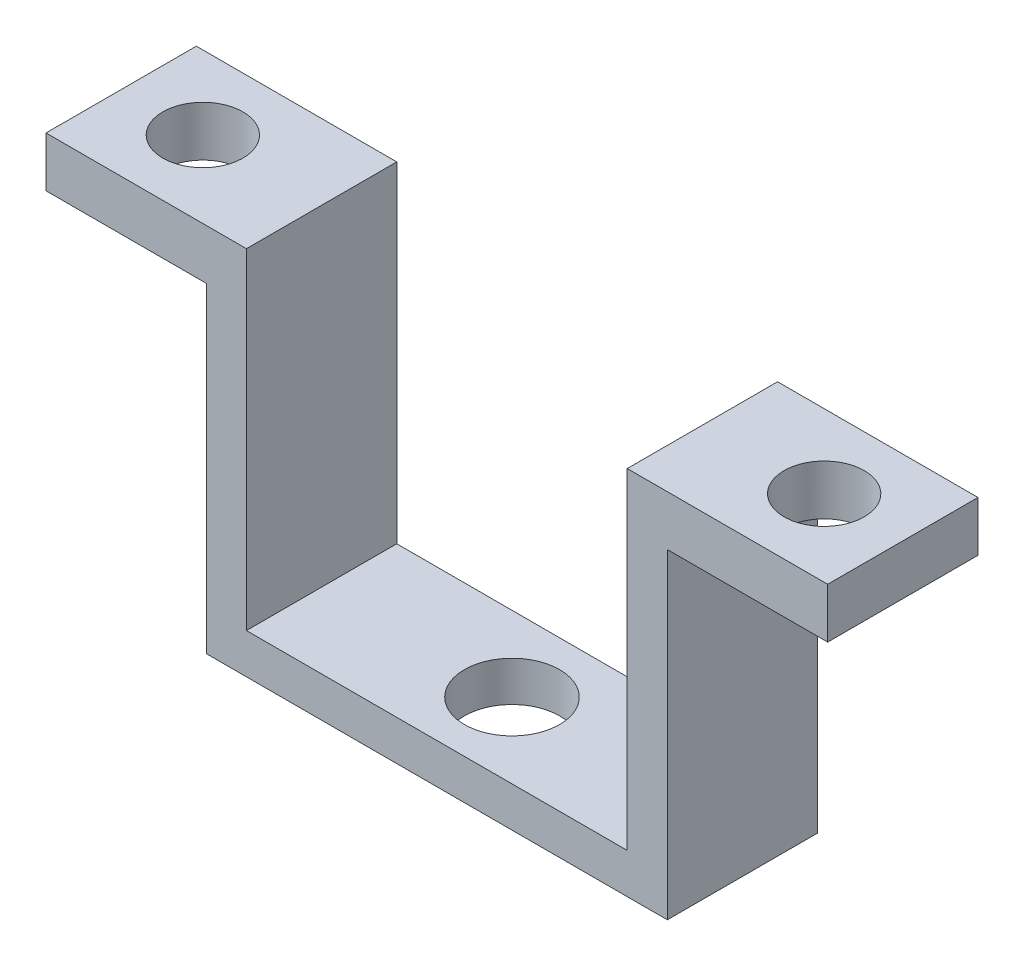
ISO-10303-21;
HEADER;
FILE_DESCRIPTION(('STEP AP214'),'2;1');
FILE_NAME('part.step','',(''),(''),'','','');
FILE_SCHEMA(('AUTOMOTIVE_DESIGN { 1 0 10303 214 1 1 1 1 }'));
ENDSEC;
DATA;
#1=APPLICATION_CONTEXT('core data for automotive mechanical design processes');
#2=APPLICATION_PROTOCOL_DEFINITION('international standard','automotive_design',2000,#1);
#3=PRODUCT_CONTEXT('',#1,'mechanical');
#4=PRODUCT('Part','Part','',(#3));
#5=PRODUCT_RELATED_PRODUCT_CATEGORY('part','',(#4));
#6=PRODUCT_DEFINITION_FORMATION('','',#4);
#7=PRODUCT_DEFINITION_CONTEXT('part definition',#1,'design');
#8=PRODUCT_DEFINITION('design','',#6,#7);
#9=PRODUCT_DEFINITION_SHAPE('','',#8);
#10=(LENGTH_UNIT() NAMED_UNIT(*) SI_UNIT(.MILLI.,.METRE.));
#11=(NAMED_UNIT(*) PLANE_ANGLE_UNIT() SI_UNIT($,.RADIAN.));
#12=(NAMED_UNIT(*) SI_UNIT($,.STERADIAN.) SOLID_ANGLE_UNIT());
#13=UNCERTAINTY_MEASURE_WITH_UNIT(LENGTH_MEASURE(1.E-05),#10,'distance_accuracy_value','');
#14=(GEOMETRIC_REPRESENTATION_CONTEXT(3) GLOBAL_UNCERTAINTY_ASSIGNED_CONTEXT((#13)) GLOBAL_UNIT_ASSIGNED_CONTEXT((#10,
#11,#12)) REPRESENTATION_CONTEXT('',''));
#15=CARTESIAN_POINT('',(0.,0.,0.));
#16=DIRECTION('',(0.,0.,1.));
#17=DIRECTION('',(1.,0.,0.));
#18=AXIS2_PLACEMENT_3D('',#15,#16,#17);
#19=CARTESIAN_POINT('',(23.,28.,7.5));
#20=DIRECTION('',(-1.,0.,0.));
#21=DIRECTION('',(0.,-1.,0.));
#22=AXIS2_PLACEMENT_3D('',#19,#20,#21);
#23=PLANE('',#22);
#24=DIRECTION('',(0.,1.,0.));
#25=VECTOR('',#24,1.);
#26=CARTESIAN_POINT('',(23.,28.,-7.5));
#27=LINE('',#26,#25);
#28=CARTESIAN_POINT('',(23.,-4.,-7.5));
#29=VERTEX_POINT('',#28);
#30=CARTESIAN_POINT('',(23.,28.,-7.5));
#31=VERTEX_POINT('',#30);
#32=EDGE_CURVE('E159',#29,#31,#27,.T.);
#33=ORIENTED_EDGE('',*,*,#32,.T.);
#34=DIRECTION('',(0.,0.,-1.));
#35=VECTOR('',#34,1.);
#36=CARTESIAN_POINT('',(23.,28.,7.5));
#37=LINE('',#36,#35);
#38=CARTESIAN_POINT('',(23.,28.,7.5));
#39=VERTEX_POINT('',#38);
#40=EDGE_CURVE('E11',#39,#31,#37,.T.);
#41=ORIENTED_EDGE('',*,*,#40,.F.);
#42=DIRECTION('',(0.,1.,0.));
#43=VECTOR('',#42,1.);
#44=CARTESIAN_POINT('',(23.,28.,7.5));
#45=LINE('',#44,#43);
#46=CARTESIAN_POINT('',(23.,-4.,7.5));
#47=VERTEX_POINT('',#46);
#48=EDGE_CURVE('E182',#47,#39,#45,.T.);
#49=ORIENTED_EDGE('',*,*,#48,.F.);
#50=DIRECTION('',(0.,0.,-1.));
#51=VECTOR('',#50,1.);
#52=CARTESIAN_POINT('',(23.,-4.,7.5));
#53=LINE('',#52,#51);
#54=EDGE_CURVE('E155',#47,#29,#53,.T.);
#55=ORIENTED_EDGE('',*,*,#54,.T.);
#56=EDGE_LOOP('',(#33,#41,#49,#55));
#57=FACE_BOUND('',#56,.T.);
#58=ADVANCED_FACE('F37',(#57),#23,.F.);
#59=CARTESIAN_POINT('',(39.,28.,7.5));
#60=DIRECTION('',(0.,1.,0.));
#61=DIRECTION('',(0.,0.,1.));
#62=AXIS2_PLACEMENT_3D('',#59,#60,#61);
#63=PLANE('',#62);
#64=CARTESIAN_POINT('',(31.,28.,-0.149250584268186));
#65=DIRECTION('',(0.,1.,0.));
#66=DIRECTION('',(0.,0.,1.));
#67=AXIS2_PLACEMENT_3D('',#64,#65,#66);
#68=CIRCLE('',#67,3.99999999999999);
#69=CARTESIAN_POINT('',(31.,28.,3.85074941573181));
#70=VERTEX_POINT('',#69);
#71=EDGE_CURVE('E207',#70,#70,#68,.T.);
#72=ORIENTED_EDGE('',*,*,#71,.T.);
#73=EDGE_LOOP('',(#72));
#74=FACE_BOUND('',#73,.T.);
#75=DIRECTION('',(1.,0.,0.));
#76=VECTOR('',#75,1.);
#77=CARTESIAN_POINT('',(39.,28.,-7.5));
#78=LINE('',#77,#76);
#79=CARTESIAN_POINT('',(39.,28.,-7.5));
#80=VERTEX_POINT('',#79);
#81=EDGE_CURVE('E162',#31,#80,#78,.T.);
#82=ORIENTED_EDGE('',*,*,#81,.T.);
#83=DIRECTION('',(0.,0.,-1.));
#84=VECTOR('',#83,1.);
#85=CARTESIAN_POINT('',(39.,28.,7.5));
#86=LINE('',#85,#84);
#87=CARTESIAN_POINT('',(39.,28.,7.5));
#88=VERTEX_POINT('',#87);
#89=EDGE_CURVE('E46',#88,#80,#86,.T.);
#90=ORIENTED_EDGE('',*,*,#89,.F.);
#91=DIRECTION('',(1.,0.,0.));
#92=VECTOR('',#91,1.);
#93=CARTESIAN_POINT('',(39.,28.,7.5));
#94=LINE('',#93,#92);
#95=EDGE_CURVE('E110',#39,#88,#94,.T.);
#96=ORIENTED_EDGE('',*,*,#95,.F.);
#97=ORIENTED_EDGE('',*,*,#40,.T.);
#98=EDGE_LOOP('',(#82,#90,#96,#97));
#99=FACE_BOUND('',#98,.T.);
#100=ADVANCED_FACE('F263',(#74,#99),#63,.F.);
#101=CARTESIAN_POINT('',(39.,33.,7.5));
#102=DIRECTION('',(-1.,0.,0.));
#103=DIRECTION('',(0.,0.,1.));
#104=AXIS2_PLACEMENT_3D('',#101,#102,#103);
#105=PLANE('',#104);
#106=DIRECTION('',(0.,1.,0.));
#107=VECTOR('',#106,1.);
#108=CARTESIAN_POINT('',(39.,33.,-7.5));
#109=LINE('',#108,#107);
#110=CARTESIAN_POINT('',(39.,33.,-7.5));
#111=VERTEX_POINT('',#110);
#112=EDGE_CURVE('E165',#80,#111,#109,.T.);
#113=ORIENTED_EDGE('',*,*,#112,.T.);
#114=DIRECTION('',(0.,0.,-1.));
#115=VECTOR('',#114,1.);
#116=CARTESIAN_POINT('',(39.,33.,7.5));
#117=LINE('',#116,#115);
#118=CARTESIAN_POINT('',(39.,33.,7.5));
#119=VERTEX_POINT('',#118);
#120=EDGE_CURVE('E201',#119,#111,#117,.T.);
#121=ORIENTED_EDGE('',*,*,#120,.F.);
#122=DIRECTION('',(0.,1.,0.));
#123=VECTOR('',#122,1.);
#124=CARTESIAN_POINT('',(39.,33.,7.5));
#125=LINE('',#124,#123);
#126=EDGE_CURVE('E224',#88,#119,#125,.T.);
#127=ORIENTED_EDGE('',*,*,#126,.F.);
#128=ORIENTED_EDGE('',*,*,#89,.T.);
#129=EDGE_LOOP('',(#113,#121,#127,#128));
#130=FACE_BOUND('',#129,.T.);
#131=ADVANCED_FACE('F267',(#130),#105,.F.);
#132=CARTESIAN_POINT('',(19.,33.,7.5));
#133=DIRECTION('',(0.,-1.,0.));
#134=DIRECTION('',(0.,0.,-1.));
#135=AXIS2_PLACEMENT_3D('',#132,#133,#134);
#136=PLANE('',#135);
#137=CARTESIAN_POINT('',(31.,33.,-0.149250584268186));
#138=DIRECTION('',(0.,-1.,0.));
#139=DIRECTION('',(0.,0.,-1.));
#140=AXIS2_PLACEMENT_3D('',#137,#138,#139);
#141=CIRCLE('',#140,3.99999999999999);
#142=CARTESIAN_POINT('',(31.,33.,-4.14925058426818));
#143=VERTEX_POINT('',#142);
#144=EDGE_CURVE('E219',#143,#143,#141,.T.);
#145=ORIENTED_EDGE('',*,*,#144,.T.);
#146=EDGE_LOOP('',(#145));
#147=FACE_BOUND('',#146,.T.);
#148=DIRECTION('',(-1.,0.,0.));
#149=VECTOR('',#148,1.);
#150=CARTESIAN_POINT('',(19.,33.,-7.5));
#151=LINE('',#150,#149);
#152=CARTESIAN_POINT('',(19.,33.,-7.5));
#153=VERTEX_POINT('',#152);
#154=EDGE_CURVE('E167',#111,#153,#151,.T.);
#155=ORIENTED_EDGE('',*,*,#154,.T.);
#156=DIRECTION('',(0.,0.,-1.));
#157=VECTOR('',#156,1.);
#158=CARTESIAN_POINT('',(19.,33.,7.5));
#159=LINE('',#158,#157);
#160=CARTESIAN_POINT('',(19.,33.,7.5));
#161=VERTEX_POINT('',#160);
#162=EDGE_CURVE('E198',#161,#153,#159,.T.);
#163=ORIENTED_EDGE('',*,*,#162,.F.);
#164=DIRECTION('',(-1.,0.,0.));
#165=VECTOR('',#164,1.);
#166=CARTESIAN_POINT('',(19.,33.,7.5));
#167=LINE('',#166,#165);
#168=EDGE_CURVE('E226',#119,#161,#167,.T.);
#169=ORIENTED_EDGE('',*,*,#168,.F.);
#170=ORIENTED_EDGE('',*,*,#120,.T.);
#171=EDGE_LOOP('',(#155,#163,#169,#170));
#172=FACE_BOUND('',#171,.T.);
#173=ADVANCED_FACE('F271',(#147,#172),#136,.F.);
#174=CARTESIAN_POINT('',(19.,0.,7.5));
#175=DIRECTION('',(1.,0.,0.));
#176=DIRECTION('',(0.,0.,-1.));
#177=AXIS2_PLACEMENT_3D('',#174,#175,#176);
#178=PLANE('',#177);
#179=DIRECTION('',(0.,-1.,0.));
#180=VECTOR('',#179,1.);
#181=CARTESIAN_POINT('',(19.,0.,-7.5));
#182=LINE('',#181,#180);
#183=CARTESIAN_POINT('',(19.,0.,-7.5));
#184=VERTEX_POINT('',#183);
#185=EDGE_CURVE('E169',#153,#184,#182,.T.);
#186=ORIENTED_EDGE('',*,*,#185,.T.);
#187=DIRECTION('',(0.,0.,-1.));
#188=VECTOR('',#187,1.);
#189=CARTESIAN_POINT('',(19.,0.,7.5));
#190=LINE('',#189,#188);
#191=CARTESIAN_POINT('',(19.,0.,7.5));
#192=VERTEX_POINT('',#191);
#193=EDGE_CURVE('E195',#192,#184,#190,.T.);
#194=ORIENTED_EDGE('',*,*,#193,.F.);
#195=DIRECTION('',(0.,-1.,0.));
#196=VECTOR('',#195,1.);
#197=CARTESIAN_POINT('',(19.,0.,7.5));
#198=LINE('',#197,#196);
#199=EDGE_CURVE('E228',#161,#192,#198,.T.);
#200=ORIENTED_EDGE('',*,*,#199,.F.);
#201=ORIENTED_EDGE('',*,*,#162,.T.);
#202=EDGE_LOOP('',(#186,#194,#200,#201));
#203=FACE_BOUND('',#202,.T.);
#204=ADVANCED_FACE('F277',(#203),#178,.F.);
#205=CARTESIAN_POINT('',(19.,0.,7.5));
#206=DIRECTION('',(0.,-1.,0.));
#207=DIRECTION('',(0.,0.,-1.));
#208=AXIS2_PLACEMENT_3D('',#205,#206,#207);
#209=PLANE('',#208);
#210=CARTESIAN_POINT('',(0.,0.,0.));
#211=DIRECTION('',(0.,-1.,0.));
#212=DIRECTION('',(0.,0.,-1.));
#213=AXIS2_PLACEMENT_3D('',#210,#211,#212);
#214=CIRCLE('',#213,4.75);
#215=CARTESIAN_POINT('',(0.,0.,-4.75));
#216=VERTEX_POINT('',#215);
#217=EDGE_CURVE('E163',#216,#216,#214,.T.);
#218=ORIENTED_EDGE('',*,*,#217,.T.);
#219=EDGE_LOOP('',(#218));
#220=FACE_BOUND('',#219,.T.);
#221=DIRECTION('',(-1.,0.,0.));
#222=VECTOR('',#221,1.);
#223=CARTESIAN_POINT('',(19.,0.,-7.5));
#224=LINE('',#223,#222);
#225=CARTESIAN_POINT('',(-19.,0.,-7.5));
#226=VERTEX_POINT('',#225);
#227=EDGE_CURVE('E171',#184,#226,#224,.T.);
#228=ORIENTED_EDGE('',*,*,#227,.T.);
#229=DIRECTION('',(0.,0.,-1.));
#230=VECTOR('',#229,1.);
#231=CARTESIAN_POINT('',(-19.,0.,7.5));
#232=LINE('',#231,#230);
#233=CARTESIAN_POINT('',(-19.,0.,7.5));
#234=VERTEX_POINT('',#233);
#235=EDGE_CURVE('E192',#234,#226,#232,.T.);
#236=ORIENTED_EDGE('',*,*,#235,.F.);
#237=DIRECTION('',(-1.,0.,0.));
#238=VECTOR('',#237,1.);
#239=CARTESIAN_POINT('',(19.,0.,7.5));
#240=LINE('',#239,#238);
#241=EDGE_CURVE('E230',#192,#234,#240,.T.);
#242=ORIENTED_EDGE('',*,*,#241,.F.);
#243=ORIENTED_EDGE('',*,*,#193,.T.);
#244=EDGE_LOOP('',(#228,#236,#242,#243));
#245=FACE_BOUND('',#244,.T.);
#246=ADVANCED_FACE('F281',(#220,#245),#209,.F.);
#247=CARTESIAN_POINT('',(-19.,0.,7.5));
#248=DIRECTION('',(-1.,0.,0.));
#249=DIRECTION('',(0.,0.,1.));
#250=AXIS2_PLACEMENT_3D('',#247,#248,#249);
#251=PLANE('',#250);
#252=DIRECTION('',(0.,1.,0.));
#253=VECTOR('',#252,1.);
#254=CARTESIAN_POINT('',(-19.,0.,-7.5));
#255=LINE('',#254,#253);
#256=CARTESIAN_POINT('',(-19.,33.,-7.5));
#257=VERTEX_POINT('',#256);
#258=EDGE_CURVE('E173',#226,#257,#255,.T.);
#259=ORIENTED_EDGE('',*,*,#258,.T.);
#260=DIRECTION('',(0.,0.,-1.));
#261=VECTOR('',#260,1.);
#262=CARTESIAN_POINT('',(-19.,33.,7.5));
#263=LINE('',#262,#261);
#264=CARTESIAN_POINT('',(-19.,33.,7.5));
#265=VERTEX_POINT('',#264);
#266=EDGE_CURVE('E189',#265,#257,#263,.T.);
#267=ORIENTED_EDGE('',*,*,#266,.F.);
#268=DIRECTION('',(0.,1.,0.));
#269=VECTOR('',#268,1.);
#270=CARTESIAN_POINT('',(-19.,0.,7.5));
#271=LINE('',#270,#269);
#272=EDGE_CURVE('E232',#234,#265,#271,.T.);
#273=ORIENTED_EDGE('',*,*,#272,.F.);
#274=ORIENTED_EDGE('',*,*,#235,.T.);
#275=EDGE_LOOP('',(#259,#267,#273,#274));
#276=FACE_BOUND('',#275,.T.);
#277=ADVANCED_FACE('F285',(#276),#251,.F.);
#278=CARTESIAN_POINT('',(-19.,33.,7.5));
#279=DIRECTION('',(0.,-1.,0.));
#280=DIRECTION('',(0.,0.,-1.));
#281=AXIS2_PLACEMENT_3D('',#278,#279,#280);
#282=PLANE('',#281);
#283=CARTESIAN_POINT('',(-31.,33.,-0.149250584268186));
#284=DIRECTION('',(0.,-1.,0.));
#285=DIRECTION('',(0.,0.,-1.));
#286=AXIS2_PLACEMENT_3D('',#283,#284,#285);
#287=CIRCLE('',#286,4.00000000000001);
#288=CARTESIAN_POINT('',(-31.,33.,-4.1492505842682));
#289=VERTEX_POINT('',#288);
#290=EDGE_CURVE('E217',#289,#289,#287,.T.);
#291=ORIENTED_EDGE('',*,*,#290,.T.);
#292=EDGE_LOOP('',(#291));
#293=FACE_BOUND('',#292,.T.);
#294=DIRECTION('',(-1.,0.,0.));
#295=VECTOR('',#294,1.);
#296=CARTESIAN_POINT('',(-19.,33.,-7.5));
#297=LINE('',#296,#295);
#298=CARTESIAN_POINT('',(-39.,33.,-7.5));
#299=VERTEX_POINT('',#298);
#300=EDGE_CURVE('E175',#257,#299,#297,.T.);
#301=ORIENTED_EDGE('',*,*,#300,.T.);
#302=DIRECTION('',(0.,0.,-1.));
#303=VECTOR('',#302,1.);
#304=CARTESIAN_POINT('',(-39.,33.,7.5));
#305=LINE('',#304,#303);
#306=CARTESIAN_POINT('',(-39.,33.,7.5));
#307=VERTEX_POINT('',#306);
#308=EDGE_CURVE('E186',#307,#299,#305,.T.);
#309=ORIENTED_EDGE('',*,*,#308,.F.);
#310=DIRECTION('',(-1.,0.,0.));
#311=VECTOR('',#310,1.);
#312=CARTESIAN_POINT('',(-19.,33.,7.5));
#313=LINE('',#312,#311);
#314=EDGE_CURVE('E234',#265,#307,#313,.T.);
#315=ORIENTED_EDGE('',*,*,#314,.F.);
#316=ORIENTED_EDGE('',*,*,#266,.T.);
#317=EDGE_LOOP('',(#301,#309,#315,#316));
#318=FACE_BOUND('',#317,.T.);
#319=ADVANCED_FACE('F240',(#293,#318),#282,.F.);
#320=CARTESIAN_POINT('',(-39.,33.,7.5));
#321=DIRECTION('',(1.,0.,0.));
#322=DIRECTION('',(0.,0.,-1.));
#323=AXIS2_PLACEMENT_3D('',#320,#321,#322);
#324=PLANE('',#323);
#325=DIRECTION('',(0.,-1.,0.));
#326=VECTOR('',#325,1.);
#327=CARTESIAN_POINT('',(-39.,33.,-7.5));
#328=LINE('',#327,#326);
#329=CARTESIAN_POINT('',(-39.,28.,-7.5));
#330=VERTEX_POINT('',#329);
#331=EDGE_CURVE('E177',#299,#330,#328,.T.);
#332=ORIENTED_EDGE('',*,*,#331,.T.);
#333=DIRECTION('',(0.,0.,-1.));
#334=VECTOR('',#333,1.);
#335=CARTESIAN_POINT('',(-39.,28.,7.5));
#336=LINE('',#335,#334);
#337=CARTESIAN_POINT('',(-39.,28.,7.5));
#338=VERTEX_POINT('',#337);
#339=EDGE_CURVE('E150',#338,#330,#336,.T.);
#340=ORIENTED_EDGE('',*,*,#339,.F.);
#341=DIRECTION('',(0.,-1.,0.));
#342=VECTOR('',#341,1.);
#343=CARTESIAN_POINT('',(-39.,33.,7.5));
#344=LINE('',#343,#342);
#345=EDGE_CURVE('E141',#307,#338,#344,.T.);
#346=ORIENTED_EDGE('',*,*,#345,.F.);
#347=ORIENTED_EDGE('',*,*,#308,.T.);
#348=EDGE_LOOP('',(#332,#340,#346,#347));
#349=FACE_BOUND('',#348,.T.);
#350=ADVANCED_FACE('F244',(#349),#324,.F.);
#351=CARTESIAN_POINT('',(-39.,28.,7.5));
#352=DIRECTION('',(0.,1.,0.));
#353=DIRECTION('',(0.,0.,1.));
#354=AXIS2_PLACEMENT_3D('',#351,#352,#353);
#355=PLANE('',#354);
#356=CARTESIAN_POINT('',(-31.,28.,-0.149250584268186));
#357=DIRECTION('',(0.,1.,0.));
#358=DIRECTION('',(0.,0.,1.));
#359=AXIS2_PLACEMENT_3D('',#356,#357,#358);
#360=CIRCLE('',#359,4.00000000000001);
#361=CARTESIAN_POINT('',(-31.,28.,3.85074941573182));
#362=VERTEX_POINT('',#361);
#363=EDGE_CURVE('E40',#362,#362,#360,.T.);
#364=ORIENTED_EDGE('',*,*,#363,.T.);
#365=EDGE_LOOP('',(#364));
#366=FACE_BOUND('',#365,.T.);
#367=DIRECTION('',(1.,0.,0.));
#368=VECTOR('',#367,1.);
#369=CARTESIAN_POINT('',(-39.,28.,-7.5));
#370=LINE('',#369,#368);
#371=CARTESIAN_POINT('',(-23.,28.,-7.5));
#372=VERTEX_POINT('',#371);
#373=EDGE_CURVE('E149',#330,#372,#370,.T.);
#374=ORIENTED_EDGE('',*,*,#373,.T.);
#375=DIRECTION('',(0.,0.,-1.));
#376=VECTOR('',#375,1.);
#377=CARTESIAN_POINT('',(-23.,28.,7.5));
#378=LINE('',#377,#376);
#379=CARTESIAN_POINT('',(-23.,28.,7.5));
#380=VERTEX_POINT('',#379);
#381=EDGE_CURVE('E146',#380,#372,#378,.T.);
#382=ORIENTED_EDGE('',*,*,#381,.F.);
#383=DIRECTION('',(1.,0.,0.));
#384=VECTOR('',#383,1.);
#385=CARTESIAN_POINT('',(-39.,28.,7.5));
#386=LINE('',#385,#384);
#387=EDGE_CURVE('E135',#338,#380,#386,.T.);
#388=ORIENTED_EDGE('',*,*,#387,.F.);
#389=ORIENTED_EDGE('',*,*,#339,.T.);
#390=EDGE_LOOP('',(#374,#382,#388,#389));
#391=FACE_BOUND('',#390,.T.);
#392=ADVANCED_FACE('F147',(#366,#391),#355,.F.);
#393=CARTESIAN_POINT('',(-23.,28.,7.5));
#394=DIRECTION('',(1.,0.,0.));
#395=DIRECTION('',(0.,1.,0.));
#396=AXIS2_PLACEMENT_3D('',#393,#394,#395);
#397=PLANE('',#396);
#398=DIRECTION('',(0.,-1.,0.));
#399=VECTOR('',#398,1.);
#400=CARTESIAN_POINT('',(-23.,28.,-7.5));
#401=LINE('',#400,#399);
#402=CARTESIAN_POINT('',(-23.,-4.,-7.5));
#403=VERTEX_POINT('',#402);
#404=EDGE_CURVE('E96',#372,#403,#401,.T.);
#405=ORIENTED_EDGE('',*,*,#404,.T.);
#406=DIRECTION('',(0.,0.,-1.));
#407=VECTOR('',#406,1.);
#408=CARTESIAN_POINT('',(-23.,-4.,7.5));
#409=LINE('',#408,#407);
#410=CARTESIAN_POINT('',(-23.,-4.,7.5));
#411=VERTEX_POINT('',#410);
#412=EDGE_CURVE('E151',#411,#403,#409,.T.);
#413=ORIENTED_EDGE('',*,*,#412,.F.);
#414=DIRECTION('',(0.,-1.,0.));
#415=VECTOR('',#414,1.);
#416=CARTESIAN_POINT('',(-23.,28.,7.5));
#417=LINE('',#416,#415);
#418=EDGE_CURVE('E139',#380,#411,#417,.T.);
#419=ORIENTED_EDGE('',*,*,#418,.F.);
#420=ORIENTED_EDGE('',*,*,#381,.T.);
#421=EDGE_LOOP('',(#405,#413,#419,#420));
#422=FACE_BOUND('',#421,.T.);
#423=ADVANCED_FACE('F153',(#422),#397,.F.);
#424=CARTESIAN_POINT('',(-23.,-4.,7.5));
#425=DIRECTION('',(0.,1.,0.));
#426=DIRECTION('',(0.,0.,1.));
#427=AXIS2_PLACEMENT_3D('',#424,#425,#426);
#428=PLANE('',#427);
#429=CARTESIAN_POINT('',(0.,-4.,0.));
#430=DIRECTION('',(0.,1.,0.));
#431=DIRECTION('',(0.,0.,1.));
#432=AXIS2_PLACEMENT_3D('',#429,#430,#431);
#433=CIRCLE('',#432,4.75);
#434=CARTESIAN_POINT('',(0.,-4.,4.75));
#435=VERTEX_POINT('',#434);
#436=EDGE_CURVE('E205',#435,#435,#433,.T.);
#437=ORIENTED_EDGE('',*,*,#436,.T.);
#438=EDGE_LOOP('',(#437));
#439=FACE_BOUND('',#438,.T.);
#440=DIRECTION('',(1.,0.,0.));
#441=VECTOR('',#440,1.);
#442=CARTESIAN_POINT('',(-23.,-4.,-7.5));
#443=LINE('',#442,#441);
#444=EDGE_CURVE('E102',#403,#29,#443,.T.);
#445=ORIENTED_EDGE('',*,*,#444,.T.);
#446=ORIENTED_EDGE('',*,*,#54,.F.);
#447=DIRECTION('',(1.,0.,0.));
#448=VECTOR('',#447,1.);
#449=CARTESIAN_POINT('',(-23.,-4.,7.5));
#450=LINE('',#449,#448);
#451=EDGE_CURVE('E55',#411,#47,#450,.T.);
#452=ORIENTED_EDGE('',*,*,#451,.F.);
#453=ORIENTED_EDGE('',*,*,#412,.T.);
#454=EDGE_LOOP('',(#445,#446,#452,#453));
#455=FACE_BOUND('',#454,.T.);
#456=ADVANCED_FACE('F252',(#439,#455),#428,.F.);
#457=CARTESIAN_POINT('',(0.,0.,7.5));
#458=DIRECTION('',(0.,0.,1.));
#459=DIRECTION('',(1.,0.,0.));
#460=AXIS2_PLACEMENT_3D('',#457,#458,#459);
#461=PLANE('',#460);
#462=ORIENTED_EDGE('',*,*,#48,.T.);
#463=ORIENTED_EDGE('',*,*,#95,.T.);
#464=ORIENTED_EDGE('',*,*,#126,.T.);
#465=ORIENTED_EDGE('',*,*,#168,.T.);
#466=ORIENTED_EDGE('',*,*,#199,.T.);
#467=ORIENTED_EDGE('',*,*,#241,.T.);
#468=ORIENTED_EDGE('',*,*,#272,.T.);
#469=ORIENTED_EDGE('',*,*,#314,.T.);
#470=ORIENTED_EDGE('',*,*,#345,.T.);
#471=ORIENTED_EDGE('',*,*,#387,.T.);
#472=ORIENTED_EDGE('',*,*,#418,.T.);
#473=ORIENTED_EDGE('',*,*,#451,.T.);
#474=EDGE_LOOP('',(#462,#463,#464,#465,#466,#467,#468,#469,#470,#471,#472,#473));
#475=FACE_BOUND('',#474,.T.);
#476=ADVANCED_FACE('F137',(#475),#461,.T.);
#477=CARTESIAN_POINT('',(0.,0.,-7.5));
#478=DIRECTION('',(0.,0.,1.));
#479=DIRECTION('',(1.,0.,0.));
#480=AXIS2_PLACEMENT_3D('',#477,#478,#479);
#481=PLANE('',#480);
#482=ORIENTED_EDGE('',*,*,#32,.F.);
#483=ORIENTED_EDGE('',*,*,#444,.F.);
#484=ORIENTED_EDGE('',*,*,#404,.F.);
#485=ORIENTED_EDGE('',*,*,#373,.F.);
#486=ORIENTED_EDGE('',*,*,#331,.F.);
#487=ORIENTED_EDGE('',*,*,#300,.F.);
#488=ORIENTED_EDGE('',*,*,#258,.F.);
#489=ORIENTED_EDGE('',*,*,#227,.F.);
#490=ORIENTED_EDGE('',*,*,#185,.F.);
#491=ORIENTED_EDGE('',*,*,#154,.F.);
#492=ORIENTED_EDGE('',*,*,#112,.F.);
#493=ORIENTED_EDGE('',*,*,#81,.F.);
#494=EDGE_LOOP('',(#482,#483,#484,#485,#486,#487,#488,#489,#490,#491,#492,#493));
#495=FACE_BOUND('',#494,.T.);
#496=ADVANCED_FACE('F247',(#495),#481,.F.);
#497=CARTESIAN_POINT('',(0.,33.,0.));
#498=DIRECTION('',(0.,-1.,0.));
#499=DIRECTION('',(0.,0.,-1.));
#500=AXIS2_PLACEMENT_3D('',#497,#498,#499);
#501=CYLINDRICAL_SURFACE('',#500,4.75);
#502=ORIENTED_EDGE('',*,*,#436,.F.);
#503=EDGE_LOOP('',(#502));
#504=FACE_BOUND('',#503,.T.);
#505=ORIENTED_EDGE('',*,*,#217,.F.);
#506=EDGE_LOOP('',(#505));
#507=FACE_BOUND('',#506,.T.);
#508=ADVANCED_FACE('F304',(#504,#507),#501,.F.);
#509=CARTESIAN_POINT('',(-31.,33.,-0.149250584268186));
#510=DIRECTION('',(0.,-1.,0.));
#511=DIRECTION('',(0.,0.,-1.));
#512=AXIS2_PLACEMENT_3D('',#509,#510,#511);
#513=CYLINDRICAL_SURFACE('',#512,4.00000000000001);
#514=ORIENTED_EDGE('',*,*,#290,.F.);
#515=EDGE_LOOP('',(#514));
#516=FACE_BOUND('',#515,.T.);
#517=ORIENTED_EDGE('',*,*,#363,.F.);
#518=EDGE_LOOP('',(#517));
#519=FACE_BOUND('',#518,.T.);
#520=ADVANCED_FACE('F301',(#516,#519),#513,.F.);
#521=CARTESIAN_POINT('',(31.,33.,-0.149250584268186));
#522=DIRECTION('',(0.,-1.,0.));
#523=DIRECTION('',(0.,0.,-1.));
#524=AXIS2_PLACEMENT_3D('',#521,#522,#523);
#525=CYLINDRICAL_SURFACE('',#524,3.99999999999999);
#526=ORIENTED_EDGE('',*,*,#144,.F.);
#527=EDGE_LOOP('',(#526));
#528=FACE_BOUND('',#527,.T.);
#529=ORIENTED_EDGE('',*,*,#71,.F.);
#530=EDGE_LOOP('',(#529));
#531=FACE_BOUND('',#530,.T.);
#532=ADVANCED_FACE('F303',(#528,#531),#525,.F.);
#533=CLOSED_SHELL('',(#58,#100,#131,#173,#204,#246,#277,#319,#350,#392,#423,#456,#476,#496,#508,
#520,#532));
#534=MANIFOLD_SOLID_BREP('B2',#533);
#535=ADVANCED_BREP_SHAPE_REPRESENTATION('',(#18,#534),#14);
#536=SHAPE_DEFINITION_REPRESENTATION(#9,#535);
ENDSEC;
END-ISO-10303-21;
